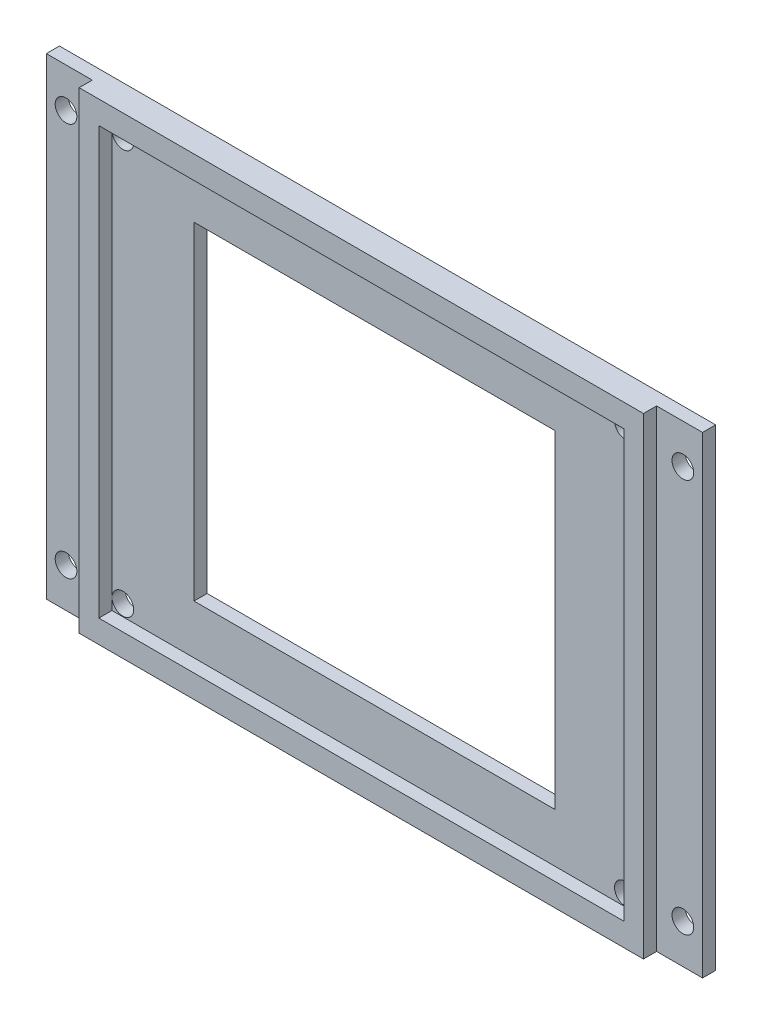
ISO-10303-21;
HEADER;
FILE_DESCRIPTION(('STEP AP214'),'2;1');
FILE_NAME('part.step','',(''),(''),'','','');
FILE_SCHEMA(('AUTOMOTIVE_DESIGN { 1 0 10303 214 1 1 1 1 }'));
ENDSEC;
DATA;
#1=APPLICATION_CONTEXT('core data for automotive mechanical design processes');
#2=APPLICATION_PROTOCOL_DEFINITION('international standard','automotive_design',2000,#1);
#3=PRODUCT_CONTEXT('',#1,'mechanical');
#4=PRODUCT('Part','Part','',(#3));
#5=PRODUCT_RELATED_PRODUCT_CATEGORY('part','',(#4));
#6=PRODUCT_DEFINITION_FORMATION('','',#4);
#7=PRODUCT_DEFINITION_CONTEXT('part definition',#1,'design');
#8=PRODUCT_DEFINITION('design','',#6,#7);
#9=PRODUCT_DEFINITION_SHAPE('','',#8);
#10=(LENGTH_UNIT() NAMED_UNIT(*) SI_UNIT(.MILLI.,.METRE.));
#11=(NAMED_UNIT(*) PLANE_ANGLE_UNIT() SI_UNIT($,.RADIAN.));
#12=(NAMED_UNIT(*) SI_UNIT($,.STERADIAN.) SOLID_ANGLE_UNIT());
#13=UNCERTAINTY_MEASURE_WITH_UNIT(LENGTH_MEASURE(1.E-05),#10,'distance_accuracy_value','');
#14=(GEOMETRIC_REPRESENTATION_CONTEXT(3) GLOBAL_UNCERTAINTY_ASSIGNED_CONTEXT((#13)) GLOBAL_UNIT_ASSIGNED_CONTEXT((#10,
#11,#12)) REPRESENTATION_CONTEXT('',''));
#15=CARTESIAN_POINT('',(0.,0.,0.));
#16=DIRECTION('',(0.,0.,1.));
#17=DIRECTION('',(1.,0.,0.));
#18=AXIS2_PLACEMENT_3D('',#15,#16,#17);
#19=CARTESIAN_POINT('',(-50.,36.,4.));
#20=DIRECTION('',(1.,0.,0.));
#21=DIRECTION('',(0.,1.,0.));
#22=AXIS2_PLACEMENT_3D('',#19,#20,#21);
#23=PLANE('',#22);
#24=DIRECTION('',(0.,-1.,0.));
#25=VECTOR('',#24,1.);
#26=CARTESIAN_POINT('',(-50.,36.,2.));
#27=LINE('',#26,#25);
#28=CARTESIAN_POINT('',(-50.,36.,2.));
#29=VERTEX_POINT('',#28);
#30=CARTESIAN_POINT('',(-50.,-36.,2.));
#31=VERTEX_POINT('',#30);
#32=EDGE_CURVE('E203',#29,#31,#27,.T.);
#33=ORIENTED_EDGE('',*,*,#32,.F.);
#34=DIRECTION('',(0.,0.,-1.));
#35=VECTOR('',#34,1.);
#36=CARTESIAN_POINT('',(-50.,36.,4.));
#37=LINE('',#36,#35);
#38=CARTESIAN_POINT('',(-50.,36.,0.));
#39=VERTEX_POINT('',#38);
#40=EDGE_CURVE('E49',#29,#39,#37,.T.);
#41=ORIENTED_EDGE('',*,*,#40,.T.);
#42=DIRECTION('',(0.,-1.,0.));
#43=VECTOR('',#42,1.);
#44=CARTESIAN_POINT('',(-50.,36.,0.));
#45=LINE('',#44,#43);
#46=CARTESIAN_POINT('',(-50.,-36.,0.));
#47=VERTEX_POINT('',#46);
#48=EDGE_CURVE('E369',#39,#47,#45,.T.);
#49=ORIENTED_EDGE('',*,*,#48,.T.);
#50=DIRECTION('',(0.,0.,-1.));
#51=VECTOR('',#50,1.);
#52=CARTESIAN_POINT('',(-50.,-36.,4.));
#53=LINE('',#52,#51);
#54=EDGE_CURVE('E378',#31,#47,#53,.T.);
#55=ORIENTED_EDGE('',*,*,#54,.F.);
#56=EDGE_LOOP('',(#33,#41,#49,#55));
#57=FACE_BOUND('',#56,.T.);
#58=ADVANCED_FACE('F39',(#57),#23,.F.);
#59=CARTESIAN_POINT('',(-47.,30.,0.));
#60=DIRECTION('',(0.,0.,1.));
#61=DIRECTION('',(1.,0.,0.));
#62=AXIS2_PLACEMENT_3D('',#59,#60,#61);
#63=CYLINDRICAL_SURFACE('',#62,1.65);
#64=CARTESIAN_POINT('',(-47.,30.,0.));
#65=DIRECTION('',(0.,0.,1.));
#66=DIRECTION('',(1.,0.,0.));
#67=AXIS2_PLACEMENT_3D('',#64,#65,#66);
#68=CIRCLE('',#67,1.65);
#69=CARTESIAN_POINT('',(-45.35,30.,0.));
#70=VERTEX_POINT('',#69);
#71=EDGE_CURVE('E264',#70,#70,#68,.T.);
#72=ORIENTED_EDGE('',*,*,#71,.F.);
#73=EDGE_LOOP('',(#72));
#74=FACE_BOUND('',#73,.T.);
#75=CARTESIAN_POINT('',(-47.,30.,2.));
#76=DIRECTION('',(0.,0.,1.));
#77=DIRECTION('',(1.,0.,0.));
#78=AXIS2_PLACEMENT_3D('',#75,#76,#77);
#79=CIRCLE('',#78,1.65);
#80=CARTESIAN_POINT('',(-45.35,30.,2.));
#81=VERTEX_POINT('',#80);
#82=EDGE_CURVE('E251',#81,#81,#79,.F.);
#83=ORIENTED_EDGE('',*,*,#82,.F.);
#84=EDGE_LOOP('',(#83));
#85=FACE_BOUND('',#84,.T.);
#86=ADVANCED_FACE('F391',(#74,#85),#63,.F.);
#87=CARTESIAN_POINT('',(-47.,-30.,0.));
#88=DIRECTION('',(0.,0.,1.));
#89=DIRECTION('',(1.,0.,0.));
#90=AXIS2_PLACEMENT_3D('',#87,#88,#89);
#91=CYLINDRICAL_SURFACE('',#90,1.65);
#92=CARTESIAN_POINT('',(-47.,-30.,0.));
#93=DIRECTION('',(0.,0.,1.));
#94=DIRECTION('',(1.,0.,0.));
#95=AXIS2_PLACEMENT_3D('',#92,#93,#94);
#96=CIRCLE('',#95,1.65);
#97=CARTESIAN_POINT('',(-45.35,-30.,0.));
#98=VERTEX_POINT('',#97);
#99=EDGE_CURVE('E259',#98,#98,#96,.T.);
#100=ORIENTED_EDGE('',*,*,#99,.F.);
#101=EDGE_LOOP('',(#100));
#102=FACE_BOUND('',#101,.T.);
#103=CARTESIAN_POINT('',(-47.,-30.,2.));
#104=DIRECTION('',(0.,0.,1.));
#105=DIRECTION('',(1.,0.,0.));
#106=AXIS2_PLACEMENT_3D('',#103,#104,#105);
#107=CIRCLE('',#106,1.65);
#108=CARTESIAN_POINT('',(-45.35,-30.,2.));
#109=VERTEX_POINT('',#108);
#110=EDGE_CURVE('E226',#109,#109,#107,.F.);
#111=ORIENTED_EDGE('',*,*,#110,.F.);
#112=EDGE_LOOP('',(#111));
#113=FACE_BOUND('',#112,.T.);
#114=ADVANCED_FACE('F389',(#102,#113),#91,.F.);
#115=CARTESIAN_POINT('',(50.,36.,4.));
#116=DIRECTION('',(-1.,0.,0.));
#117=DIRECTION('',(0.,-1.,0.));
#118=AXIS2_PLACEMENT_3D('',#115,#116,#117);
#119=PLANE('',#118);
#120=DIRECTION('',(0.,0.,-1.));
#121=VECTOR('',#120,1.);
#122=CARTESIAN_POINT('',(50.,36.,4.));
#123=LINE('',#122,#121);
#124=CARTESIAN_POINT('',(50.,36.,2.));
#125=VERTEX_POINT('',#124);
#126=CARTESIAN_POINT('',(50.,36.,0.));
#127=VERTEX_POINT('',#126);
#128=EDGE_CURVE('E11',#125,#127,#123,.T.);
#129=ORIENTED_EDGE('',*,*,#128,.F.);
#130=DIRECTION('',(0.,1.,0.));
#131=VECTOR('',#130,1.);
#132=CARTESIAN_POINT('',(50.,36.,2.));
#133=LINE('',#132,#131);
#134=CARTESIAN_POINT('',(50.,-36.,2.));
#135=VERTEX_POINT('',#134);
#136=EDGE_CURVE('E229',#135,#125,#133,.T.);
#137=ORIENTED_EDGE('',*,*,#136,.F.);
#138=DIRECTION('',(0.,0.,-1.));
#139=VECTOR('',#138,1.);
#140=CARTESIAN_POINT('',(50.,-36.,4.));
#141=LINE('',#140,#139);
#142=CARTESIAN_POINT('',(50.,-36.,0.));
#143=VERTEX_POINT('',#142);
#144=EDGE_CURVE('E361',#135,#143,#141,.T.);
#145=ORIENTED_EDGE('',*,*,#144,.T.);
#146=DIRECTION('',(0.,1.,0.));
#147=VECTOR('',#146,1.);
#148=CARTESIAN_POINT('',(50.,36.,0.));
#149=LINE('',#148,#147);
#150=EDGE_CURVE('E342',#143,#127,#149,.T.);
#151=ORIENTED_EDGE('',*,*,#150,.T.);
#152=EDGE_LOOP('',(#129,#137,#145,#151));
#153=FACE_BOUND('',#152,.T.);
#154=ADVANCED_FACE('F41',(#153),#119,.F.);
#155=CARTESIAN_POINT('',(-50.,36.,4.));
#156=DIRECTION('',(0.,-1.,0.));
#157=DIRECTION('',(0.,0.,-1.));
#158=AXIS2_PLACEMENT_3D('',#155,#156,#157);
#159=PLANE('',#158);
#160=DIRECTION('',(-1.,0.,0.));
#161=VECTOR('',#160,1.);
#162=CARTESIAN_POINT('',(-50.,36.,2.));
#163=LINE('',#162,#161);
#164=CARTESIAN_POINT('',(-43.,36.,2.));
#165=VERTEX_POINT('',#164);
#166=EDGE_CURVE('E215',#165,#29,#163,.T.);
#167=ORIENTED_EDGE('',*,*,#166,.F.);
#168=DIRECTION('',(0.,0.,1.));
#169=VECTOR('',#168,1.);
#170=CARTESIAN_POINT('',(-43.,36.,2.));
#171=LINE('',#170,#169);
#172=CARTESIAN_POINT('',(-43.,36.,4.));
#173=VERTEX_POINT('',#172);
#174=EDGE_CURVE('E222',#165,#173,#171,.T.);
#175=ORIENTED_EDGE('',*,*,#174,.T.);
#176=DIRECTION('',(-1.,0.,0.));
#177=VECTOR('',#176,1.);
#178=CARTESIAN_POINT('',(-50.,36.,4.));
#179=LINE('',#178,#177);
#180=CARTESIAN_POINT('',(43.,36.,4.));
#181=VERTEX_POINT('',#180);
#182=EDGE_CURVE('E352',#181,#173,#179,.T.);
#183=ORIENTED_EDGE('',*,*,#182,.F.);
#184=DIRECTION('',(0.,0.,1.));
#185=VECTOR('',#184,1.);
#186=CARTESIAN_POINT('',(43.,36.,2.));
#187=LINE('',#186,#185);
#188=CARTESIAN_POINT('',(43.,36.,2.));
#189=VERTEX_POINT('',#188);
#190=EDGE_CURVE('E243',#189,#181,#187,.T.);
#191=ORIENTED_EDGE('',*,*,#190,.F.);
#192=DIRECTION('',(-1.,0.,0.));
#193=VECTOR('',#192,1.);
#194=CARTESIAN_POINT('',(50.,36.,2.));
#195=LINE('',#194,#193);
#196=EDGE_CURVE('E232',#125,#189,#195,.T.);
#197=ORIENTED_EDGE('',*,*,#196,.F.);
#198=ORIENTED_EDGE('',*,*,#128,.T.);
#199=DIRECTION('',(-1.,0.,0.));
#200=VECTOR('',#199,1.);
#201=CARTESIAN_POINT('',(-50.,36.,0.));
#202=LINE('',#201,#200);
#203=EDGE_CURVE('E365',#127,#39,#202,.T.);
#204=ORIENTED_EDGE('',*,*,#203,.T.);
#205=ORIENTED_EDGE('',*,*,#40,.F.);
#206=EDGE_LOOP('',(#167,#175,#183,#191,#197,#198,#204,#205));
#207=FACE_BOUND('',#206,.T.);
#208=ADVANCED_FACE('F398',(#207),#159,.F.);
#209=CARTESIAN_POINT('',(-50.,-36.,4.));
#210=DIRECTION('',(0.,1.,0.));
#211=DIRECTION('',(0.,0.,1.));
#212=AXIS2_PLACEMENT_3D('',#209,#210,#211);
#213=PLANE('',#212);
#214=DIRECTION('',(1.,0.,0.));
#215=VECTOR('',#214,1.);
#216=CARTESIAN_POINT('',(-50.,-36.,4.));
#217=LINE('',#216,#215);
#218=CARTESIAN_POINT('',(-43.,-36.,4.));
#219=VERTEX_POINT('',#218);
#220=CARTESIAN_POINT('',(43.,-36.,4.));
#221=VERTEX_POINT('',#220);
#222=EDGE_CURVE('E356',#219,#221,#217,.T.);
#223=ORIENTED_EDGE('',*,*,#222,.F.);
#224=DIRECTION('',(0.,0.,1.));
#225=VECTOR('',#224,1.);
#226=CARTESIAN_POINT('',(-43.,-36.,2.));
#227=LINE('',#226,#225);
#228=CARTESIAN_POINT('',(-43.,-36.,2.));
#229=VERTEX_POINT('',#228);
#230=EDGE_CURVE('E218',#229,#219,#227,.T.);
#231=ORIENTED_EDGE('',*,*,#230,.F.);
#232=DIRECTION('',(1.,0.,0.));
#233=VECTOR('',#232,1.);
#234=CARTESIAN_POINT('',(-50.,-36.,2.));
#235=LINE('',#234,#233);
#236=EDGE_CURVE('E206',#31,#229,#235,.T.);
#237=ORIENTED_EDGE('',*,*,#236,.F.);
#238=ORIENTED_EDGE('',*,*,#54,.T.);
#239=DIRECTION('',(1.,0.,0.));
#240=VECTOR('',#239,1.);
#241=CARTESIAN_POINT('',(-50.,-36.,0.));
#242=LINE('',#241,#240);
#243=EDGE_CURVE('E357',#47,#143,#242,.T.);
#244=ORIENTED_EDGE('',*,*,#243,.T.);
#245=ORIENTED_EDGE('',*,*,#144,.F.);
#246=DIRECTION('',(1.,0.,0.));
#247=VECTOR('',#246,1.);
#248=CARTESIAN_POINT('',(50.,-36.,2.));
#249=LINE('',#248,#247);
#250=CARTESIAN_POINT('',(43.,-36.,2.));
#251=VERTEX_POINT('',#250);
#252=EDGE_CURVE('E240',#251,#135,#249,.T.);
#253=ORIENTED_EDGE('',*,*,#252,.F.);
#254=DIRECTION('',(0.,0.,1.));
#255=VECTOR('',#254,1.);
#256=CARTESIAN_POINT('',(43.,-36.,2.));
#257=LINE('',#256,#255);
#258=EDGE_CURVE('E221',#251,#221,#257,.T.);
#259=ORIENTED_EDGE('',*,*,#258,.T.);
#260=EDGE_LOOP('',(#223,#231,#237,#238,#244,#245,#253,#259));
#261=FACE_BOUND('',#260,.T.);
#262=ADVANCED_FACE('F411',(#261),#213,.F.);
#263=CARTESIAN_POINT('',(0.,0.,4.));
#264=DIRECTION('',(0.,0.,1.));
#265=DIRECTION('',(1.,0.,0.));
#266=AXIS2_PLACEMENT_3D('',#263,#264,#265);
#267=PLANE('',#266);
#268=DIRECTION('',(0.,1.,0.));
#269=VECTOR('',#268,1.);
#270=CARTESIAN_POINT('',(-43.,36.,4.));
#271=LINE('',#270,#269);
#272=EDGE_CURVE('E207',#219,#173,#271,.T.);
#273=ORIENTED_EDGE('',*,*,#272,.F.);
#274=ORIENTED_EDGE('',*,*,#222,.T.);
#275=DIRECTION('',(0.,-1.,0.));
#276=VECTOR('',#275,1.);
#277=CARTESIAN_POINT('',(43.,36.,4.));
#278=LINE('',#277,#276);
#279=EDGE_CURVE('E197',#181,#221,#278,.T.);
#280=ORIENTED_EDGE('',*,*,#279,.F.);
#281=ORIENTED_EDGE('',*,*,#182,.T.);
#282=EDGE_LOOP('',(#273,#274,#280,#281));
#283=FACE_BOUND('',#282,.T.);
#284=DIRECTION('',(0.,1.,0.));
#285=VECTOR('',#284,1.);
#286=CARTESIAN_POINT('',(40.,32.5,4.));
#287=LINE('',#286,#285);
#288=CARTESIAN_POINT('',(40.,-32.5,4.));
#289=VERTEX_POINT('',#288);
#290=CARTESIAN_POINT('',(40.,32.5,4.));
#291=VERTEX_POINT('',#290);
#292=EDGE_CURVE('E304',#289,#291,#287,.T.);
#293=ORIENTED_EDGE('',*,*,#292,.F.);
#294=DIRECTION('',(1.,0.,0.));
#295=VECTOR('',#294,1.);
#296=CARTESIAN_POINT('',(-40.,-32.5,4.));
#297=LINE('',#296,#295);
#298=CARTESIAN_POINT('',(-40.,-32.5,4.));
#299=VERTEX_POINT('',#298);
#300=EDGE_CURVE('E313',#299,#289,#297,.T.);
#301=ORIENTED_EDGE('',*,*,#300,.F.);
#302=DIRECTION('',(0.,-1.,0.));
#303=VECTOR('',#302,1.);
#304=CARTESIAN_POINT('',(-40.,32.5,4.));
#305=LINE('',#304,#303);
#306=CARTESIAN_POINT('',(-40.,32.5,4.));
#307=VERTEX_POINT('',#306);
#308=EDGE_CURVE('E332',#307,#299,#305,.T.);
#309=ORIENTED_EDGE('',*,*,#308,.F.);
#310=DIRECTION('',(-1.,0.,0.));
#311=VECTOR('',#310,1.);
#312=CARTESIAN_POINT('',(-40.,32.5,4.));
#313=LINE('',#312,#311);
#314=EDGE_CURVE('E328',#291,#307,#313,.T.);
#315=ORIENTED_EDGE('',*,*,#314,.F.);
#316=EDGE_LOOP('',(#293,#301,#309,#315));
#317=FACE_BOUND('',#316,.T.);
#318=ADVANCED_FACE('F418',(#283,#317),#267,.T.);
#319=CARTESIAN_POINT('',(0.,0.,0.));
#320=DIRECTION('',(0.,0.,1.));
#321=DIRECTION('',(1.,0.,0.));
#322=AXIS2_PLACEMENT_3D('',#319,#320,#321);
#323=PLANE('',#322);
#324=DIRECTION('',(1.,0.,0.));
#325=VECTOR('',#324,1.);
#326=CARTESIAN_POINT('',(-27.5,-25.,0.));
#327=LINE('',#326,#325);
#328=CARTESIAN_POINT('',(-27.5,-25.,0.));
#329=VERTEX_POINT('',#328);
#330=CARTESIAN_POINT('',(27.5,-25.,0.));
#331=VERTEX_POINT('',#330);
#332=EDGE_CURVE('E163',#329,#331,#327,.T.);
#333=ORIENTED_EDGE('',*,*,#332,.T.);
#334=DIRECTION('',(0.,1.,0.));
#335=VECTOR('',#334,1.);
#336=CARTESIAN_POINT('',(27.5,25.,0.));
#337=LINE('',#336,#335);
#338=CARTESIAN_POINT('',(27.5,25.,0.));
#339=VERTEX_POINT('',#338);
#340=EDGE_CURVE('E156',#331,#339,#337,.T.);
#341=ORIENTED_EDGE('',*,*,#340,.T.);
#342=DIRECTION('',(-1.,0.,0.));
#343=VECTOR('',#342,1.);
#344=CARTESIAN_POINT('',(-27.5,25.,0.));
#345=LINE('',#344,#343);
#346=CARTESIAN_POINT('',(-27.5,25.,0.));
#347=VERTEX_POINT('',#346);
#348=EDGE_CURVE('E166',#339,#347,#345,.T.);
#349=ORIENTED_EDGE('',*,*,#348,.T.);
#350=DIRECTION('',(0.,-1.,0.));
#351=VECTOR('',#350,1.);
#352=CARTESIAN_POINT('',(-27.5,25.,0.));
#353=LINE('',#352,#351);
#354=EDGE_CURVE('E57',#347,#329,#353,.T.);
#355=ORIENTED_EDGE('',*,*,#354,.T.);
#356=EDGE_LOOP('',(#333,#341,#349,#355));
#357=FACE_BOUND('',#356,.T.);
#358=ORIENTED_EDGE('',*,*,#99,.T.);
#359=EDGE_LOOP('',(#358));
#360=FACE_BOUND('',#359,.T.);
#361=CARTESIAN_POINT('',(47.,-30.,0.));
#362=DIRECTION('',(0.,0.,1.));
#363=DIRECTION('',(1.,0.,0.));
#364=AXIS2_PLACEMENT_3D('',#361,#362,#363);
#365=CIRCLE('',#364,1.65);
#366=CARTESIAN_POINT('',(48.65,-30.,0.));
#367=VERTEX_POINT('',#366);
#368=EDGE_CURVE('E265',#367,#367,#365,.T.);
#369=ORIENTED_EDGE('',*,*,#368,.T.);
#370=EDGE_LOOP('',(#369));
#371=FACE_BOUND('',#370,.T.);
#372=CARTESIAN_POINT('',(47.,30.,0.));
#373=DIRECTION('',(0.,0.,1.));
#374=DIRECTION('',(1.,0.,0.));
#375=AXIS2_PLACEMENT_3D('',#372,#373,#374);
#376=CIRCLE('',#375,1.65);
#377=CARTESIAN_POINT('',(48.65,30.,0.));
#378=VERTEX_POINT('',#377);
#379=EDGE_CURVE('E260',#378,#378,#376,.T.);
#380=ORIENTED_EDGE('',*,*,#379,.T.);
#381=EDGE_LOOP('',(#380));
#382=FACE_BOUND('',#381,.T.);
#383=ORIENTED_EDGE('',*,*,#71,.T.);
#384=EDGE_LOOP('',(#383));
#385=FACE_BOUND('',#384,.T.);
#386=CARTESIAN_POINT('',(-38.3403916412942,-30.7585866803809,0.));
#387=DIRECTION('',(0.,0.,1.));
#388=DIRECTION('',(1.,0.,0.));
#389=AXIS2_PLACEMENT_3D('',#386,#387,#388);
#390=CIRCLE('',#389,1.65);
#391=CARTESIAN_POINT('',(-36.6903916412942,-30.7585866803809,0.));
#392=VERTEX_POINT('',#391);
#393=EDGE_CURVE('E293',#392,#392,#390,.T.);
#394=ORIENTED_EDGE('',*,*,#393,.T.);
#395=EDGE_LOOP('',(#394));
#396=FACE_BOUND('',#395,.T.);
#397=CARTESIAN_POINT('',(38.2406083587058,-30.7585866803809,0.));
#398=DIRECTION('',(0.,0.,1.));
#399=DIRECTION('',(1.,0.,0.));
#400=AXIS2_PLACEMENT_3D('',#397,#398,#399);
#401=CIRCLE('',#400,1.65);
#402=CARTESIAN_POINT('',(39.8906083587058,-30.7585866803809,0.));
#403=VERTEX_POINT('',#402);
#404=EDGE_CURVE('E285',#403,#403,#401,.T.);
#405=ORIENTED_EDGE('',*,*,#404,.T.);
#406=EDGE_LOOP('',(#405));
#407=FACE_BOUND('',#406,.T.);
#408=CARTESIAN_POINT('',(38.2406083587058,30.8364133196191,0.));
#409=DIRECTION('',(0.,0.,1.));
#410=DIRECTION('',(1.,0.,0.));
#411=AXIS2_PLACEMENT_3D('',#408,#409,#410);
#412=CIRCLE('',#411,1.65);
#413=CARTESIAN_POINT('',(39.8906083587058,30.8364133196191,0.));
#414=VERTEX_POINT('',#413);
#415=EDGE_CURVE('E276',#414,#414,#412,.T.);
#416=ORIENTED_EDGE('',*,*,#415,.T.);
#417=EDGE_LOOP('',(#416));
#418=FACE_BOUND('',#417,.T.);
#419=CARTESIAN_POINT('',(-38.3403916412942,30.8364133196191,0.));
#420=DIRECTION('',(0.,0.,1.));
#421=DIRECTION('',(1.,0.,0.));
#422=AXIS2_PLACEMENT_3D('',#419,#420,#421);
#423=CIRCLE('',#422,1.65);
#424=CARTESIAN_POINT('',(-36.6903916412942,30.8364133196191,0.));
#425=VERTEX_POINT('',#424);
#426=EDGE_CURVE('E300',#425,#425,#423,.T.);
#427=ORIENTED_EDGE('',*,*,#426,.T.);
#428=EDGE_LOOP('',(#427));
#429=FACE_BOUND('',#428,.T.);
#430=ORIENTED_EDGE('',*,*,#150,.F.);
#431=ORIENTED_EDGE('',*,*,#243,.F.);
#432=ORIENTED_EDGE('',*,*,#48,.F.);
#433=ORIENTED_EDGE('',*,*,#203,.F.);
#434=EDGE_LOOP('',(#430,#431,#432,#433));
#435=FACE_BOUND('',#434,.T.);
#436=ADVANCED_FACE('F171',(#357,#360,#371,#382,#385,#396,#407,#418,#429,#435),#323,.F.);
#437=CARTESIAN_POINT('',(40.,32.5,2.));
#438=DIRECTION('',(1.,0.,0.));
#439=DIRECTION('',(0.,0.,-1.));
#440=AXIS2_PLACEMENT_3D('',#437,#438,#439);
#441=PLANE('',#440);
#442=ORIENTED_EDGE('',*,*,#292,.T.);
#443=DIRECTION('',(0.,0.,1.));
#444=VECTOR('',#443,1.);
#445=CARTESIAN_POINT('',(40.,32.5,2.));
#446=LINE('',#445,#444);
#447=CARTESIAN_POINT('',(40.,32.5,2.));
#448=VERTEX_POINT('',#447);
#449=EDGE_CURVE('E325',#448,#291,#446,.T.);
#450=ORIENTED_EDGE('',*,*,#449,.F.);
#451=DIRECTION('',(0.,1.,0.));
#452=VECTOR('',#451,1.);
#453=CARTESIAN_POINT('',(40.,32.5,2.));
#454=LINE('',#453,#452);
#455=CARTESIAN_POINT('',(40.,-32.5,2.));
#456=VERTEX_POINT('',#455);
#457=EDGE_CURVE('E308',#456,#448,#454,.T.);
#458=ORIENTED_EDGE('',*,*,#457,.F.);
#459=DIRECTION('',(0.,0.,1.));
#460=VECTOR('',#459,1.);
#461=CARTESIAN_POINT('',(40.,-32.5,2.));
#462=LINE('',#461,#460);
#463=EDGE_CURVE('E339',#456,#289,#462,.T.);
#464=ORIENTED_EDGE('',*,*,#463,.T.);
#465=EDGE_LOOP('',(#442,#450,#458,#464));
#466=FACE_BOUND('',#465,.T.);
#467=ADVANCED_FACE('F451',(#466),#441,.F.);
#468=CARTESIAN_POINT('',(-40.,-32.5,2.));
#469=DIRECTION('',(0.,-1.,0.));
#470=DIRECTION('',(0.,0.,-1.));
#471=AXIS2_PLACEMENT_3D('',#468,#469,#470);
#472=PLANE('',#471);
#473=ORIENTED_EDGE('',*,*,#300,.T.);
#474=ORIENTED_EDGE('',*,*,#463,.F.);
#475=DIRECTION('',(1.,0.,0.));
#476=VECTOR('',#475,1.);
#477=CARTESIAN_POINT('',(-40.,-32.5,2.));
#478=LINE('',#477,#476);
#479=CARTESIAN_POINT('',(-40.,-32.5,2.));
#480=VERTEX_POINT('',#479);
#481=EDGE_CURVE('E321',#480,#456,#478,.T.);
#482=ORIENTED_EDGE('',*,*,#481,.F.);
#483=DIRECTION('',(0.,0.,1.));
#484=VECTOR('',#483,1.);
#485=CARTESIAN_POINT('',(-40.,-32.5,2.));
#486=LINE('',#485,#484);
#487=EDGE_CURVE('E343',#480,#299,#486,.T.);
#488=ORIENTED_EDGE('',*,*,#487,.T.);
#489=EDGE_LOOP('',(#473,#474,#482,#488));
#490=FACE_BOUND('',#489,.T.);
#491=ADVANCED_FACE('F456',(#490),#472,.F.);
#492=CARTESIAN_POINT('',(-40.,32.5,2.));
#493=DIRECTION('',(-1.,0.,0.));
#494=DIRECTION('',(0.,-1.,0.));
#495=AXIS2_PLACEMENT_3D('',#492,#493,#494);
#496=PLANE('',#495);
#497=ORIENTED_EDGE('',*,*,#308,.T.);
#498=ORIENTED_EDGE('',*,*,#487,.F.);
#499=DIRECTION('',(0.,-1.,0.));
#500=VECTOR('',#499,1.);
#501=CARTESIAN_POINT('',(-40.,32.5,2.));
#502=LINE('',#501,#500);
#503=CARTESIAN_POINT('',(-40.,32.5,2.));
#504=VERTEX_POINT('',#503);
#505=EDGE_CURVE('E317',#504,#480,#502,.T.);
#506=ORIENTED_EDGE('',*,*,#505,.F.);
#507=DIRECTION('',(0.,0.,1.));
#508=VECTOR('',#507,1.);
#509=CARTESIAN_POINT('',(-40.,32.5,2.));
#510=LINE('',#509,#508);
#511=EDGE_CURVE('E346',#504,#307,#510,.T.);
#512=ORIENTED_EDGE('',*,*,#511,.T.);
#513=EDGE_LOOP('',(#497,#498,#506,#512));
#514=FACE_BOUND('',#513,.T.);
#515=ADVANCED_FACE('F465',(#514),#496,.F.);
#516=CARTESIAN_POINT('',(-40.,32.5,2.));
#517=DIRECTION('',(0.,1.,0.));
#518=DIRECTION('',(0.,0.,1.));
#519=AXIS2_PLACEMENT_3D('',#516,#517,#518);
#520=PLANE('',#519);
#521=ORIENTED_EDGE('',*,*,#314,.T.);
#522=ORIENTED_EDGE('',*,*,#511,.F.);
#523=DIRECTION('',(-1.,0.,0.));
#524=VECTOR('',#523,1.);
#525=CARTESIAN_POINT('',(-40.,32.5,2.));
#526=LINE('',#525,#524);
#527=EDGE_CURVE('E312',#448,#504,#526,.T.);
#528=ORIENTED_EDGE('',*,*,#527,.F.);
#529=ORIENTED_EDGE('',*,*,#449,.T.);
#530=EDGE_LOOP('',(#521,#522,#528,#529));
#531=FACE_BOUND('',#530,.T.);
#532=ADVANCED_FACE('F461',(#531),#520,.F.);
#533=CARTESIAN_POINT('',(0.,0.,2.));
#534=DIRECTION('',(0.,0.,1.));
#535=DIRECTION('',(1.,0.,0.));
#536=AXIS2_PLACEMENT_3D('',#533,#534,#535);
#537=PLANE('',#536);
#538=DIRECTION('',(0.,1.,0.));
#539=VECTOR('',#538,1.);
#540=CARTESIAN_POINT('',(27.5,25.,2.));
#541=LINE('',#540,#539);
#542=CARTESIAN_POINT('',(27.5,-25.,2.));
#543=VERTEX_POINT('',#542);
#544=CARTESIAN_POINT('',(27.5,25.,2.));
#545=VERTEX_POINT('',#544);
#546=EDGE_CURVE('E65',#543,#545,#541,.T.);
#547=ORIENTED_EDGE('',*,*,#546,.F.);
#548=DIRECTION('',(1.,0.,0.));
#549=VECTOR('',#548,1.);
#550=CARTESIAN_POINT('',(-27.5,-25.,2.));
#551=LINE('',#550,#549);
#552=CARTESIAN_POINT('',(-27.5,-25.,2.));
#553=VERTEX_POINT('',#552);
#554=EDGE_CURVE('E175',#553,#543,#551,.T.);
#555=ORIENTED_EDGE('',*,*,#554,.F.);
#556=DIRECTION('',(0.,-1.,0.));
#557=VECTOR('',#556,1.);
#558=CARTESIAN_POINT('',(-27.5,25.,2.));
#559=LINE('',#558,#557);
#560=CARTESIAN_POINT('',(-27.5,25.,2.));
#561=VERTEX_POINT('',#560);
#562=EDGE_CURVE('E179',#561,#553,#559,.T.);
#563=ORIENTED_EDGE('',*,*,#562,.F.);
#564=DIRECTION('',(-1.,0.,0.));
#565=VECTOR('',#564,1.);
#566=CARTESIAN_POINT('',(-27.5,25.,2.));
#567=LINE('',#566,#565);
#568=EDGE_CURVE('E188',#545,#561,#567,.T.);
#569=ORIENTED_EDGE('',*,*,#568,.F.);
#570=EDGE_LOOP('',(#547,#555,#563,#569));
#571=FACE_BOUND('',#570,.T.);
#572=CARTESIAN_POINT('',(-38.3403916412942,-30.7585866803809,2.));
#573=DIRECTION('',(0.,0.,1.));
#574=DIRECTION('',(1.,0.,0.));
#575=AXIS2_PLACEMENT_3D('',#572,#573,#574);
#576=CIRCLE('',#575,1.65);
#577=CARTESIAN_POINT('',(-36.6903916412942,-30.7585866803809,2.));
#578=VERTEX_POINT('',#577);
#579=EDGE_CURVE('E275',#578,#578,#576,.T.);
#580=ORIENTED_EDGE('',*,*,#579,.F.);
#581=EDGE_LOOP('',(#580));
#582=FACE_BOUND('',#581,.T.);
#583=CARTESIAN_POINT('',(38.2406083587058,-30.7585866803809,2.));
#584=DIRECTION('',(0.,0.,1.));
#585=DIRECTION('',(1.,0.,0.));
#586=AXIS2_PLACEMENT_3D('',#583,#584,#585);
#587=CIRCLE('',#586,1.65);
#588=CARTESIAN_POINT('',(39.8906083587058,-30.7585866803809,2.));
#589=VERTEX_POINT('',#588);
#590=EDGE_CURVE('E289',#589,#589,#587,.T.);
#591=ORIENTED_EDGE('',*,*,#590,.F.);
#592=EDGE_LOOP('',(#591));
#593=FACE_BOUND('',#592,.T.);
#594=CARTESIAN_POINT('',(38.2406083587058,30.8364133196191,2.));
#595=DIRECTION('',(0.,0.,1.));
#596=DIRECTION('',(1.,0.,0.));
#597=AXIS2_PLACEMENT_3D('',#594,#595,#596);
#598=CIRCLE('',#597,1.65);
#599=CARTESIAN_POINT('',(39.8906083587058,30.8364133196191,2.));
#600=VERTEX_POINT('',#599);
#601=EDGE_CURVE('E281',#600,#600,#598,.T.);
#602=ORIENTED_EDGE('',*,*,#601,.F.);
#603=EDGE_LOOP('',(#602));
#604=FACE_BOUND('',#603,.T.);
#605=CARTESIAN_POINT('',(-38.3403916412942,30.8364133196191,2.));
#606=DIRECTION('',(0.,0.,1.));
#607=DIRECTION('',(1.,0.,0.));
#608=AXIS2_PLACEMENT_3D('',#605,#606,#607);
#609=CIRCLE('',#608,1.65);
#610=CARTESIAN_POINT('',(-36.6903916412942,30.8364133196191,2.));
#611=VERTEX_POINT('',#610);
#612=EDGE_CURVE('E280',#611,#611,#609,.T.);
#613=ORIENTED_EDGE('',*,*,#612,.F.);
#614=EDGE_LOOP('',(#613));
#615=FACE_BOUND('',#614,.T.);
#616=ORIENTED_EDGE('',*,*,#457,.T.);
#617=ORIENTED_EDGE('',*,*,#527,.T.);
#618=ORIENTED_EDGE('',*,*,#505,.T.);
#619=ORIENTED_EDGE('',*,*,#481,.T.);
#620=EDGE_LOOP('',(#616,#617,#618,#619));
#621=FACE_BOUND('',#620,.T.);
#622=ADVANCED_FACE('F464',(#571,#582,#593,#604,#615,#621),#537,.T.);
#623=CARTESIAN_POINT('',(-38.3403916412942,30.8364133196191,0.));
#624=DIRECTION('',(0.,0.,1.));
#625=DIRECTION('',(1.,0.,0.));
#626=AXIS2_PLACEMENT_3D('',#623,#624,#625);
#627=CYLINDRICAL_SURFACE('',#626,1.65);
#628=ORIENTED_EDGE('',*,*,#426,.F.);
#629=EDGE_LOOP('',(#628));
#630=FACE_BOUND('',#629,.T.);
#631=ORIENTED_EDGE('',*,*,#612,.T.);
#632=EDGE_LOOP('',(#631));
#633=FACE_BOUND('',#632,.T.);
#634=ADVANCED_FACE('F475',(#630,#633),#627,.F.);
#635=CARTESIAN_POINT('',(38.2406083587058,30.8364133196191,0.));
#636=DIRECTION('',(0.,0.,1.));
#637=DIRECTION('',(1.,0.,0.));
#638=AXIS2_PLACEMENT_3D('',#635,#636,#637);
#639=CYLINDRICAL_SURFACE('',#638,1.65);
#640=ORIENTED_EDGE('',*,*,#415,.F.);
#641=EDGE_LOOP('',(#640));
#642=FACE_BOUND('',#641,.T.);
#643=ORIENTED_EDGE('',*,*,#601,.T.);
#644=EDGE_LOOP('',(#643));
#645=FACE_BOUND('',#644,.T.);
#646=ADVANCED_FACE('F479',(#642,#645),#639,.F.);
#647=CARTESIAN_POINT('',(38.2406083587058,-30.7585866803809,0.));
#648=DIRECTION('',(0.,0.,1.));
#649=DIRECTION('',(1.,0.,0.));
#650=AXIS2_PLACEMENT_3D('',#647,#648,#649);
#651=CYLINDRICAL_SURFACE('',#650,1.65);
#652=ORIENTED_EDGE('',*,*,#404,.F.);
#653=EDGE_LOOP('',(#652));
#654=FACE_BOUND('',#653,.T.);
#655=ORIENTED_EDGE('',*,*,#590,.T.);
#656=EDGE_LOOP('',(#655));
#657=FACE_BOUND('',#656,.T.);
#658=ADVANCED_FACE('F485',(#654,#657),#651,.F.);
#659=CARTESIAN_POINT('',(-38.3403916412942,-30.7585866803809,0.));
#660=DIRECTION('',(0.,0.,1.));
#661=DIRECTION('',(1.,0.,0.));
#662=AXIS2_PLACEMENT_3D('',#659,#660,#661);
#663=CYLINDRICAL_SURFACE('',#662,1.65);
#664=ORIENTED_EDGE('',*,*,#393,.F.);
#665=EDGE_LOOP('',(#664));
#666=FACE_BOUND('',#665,.T.);
#667=ORIENTED_EDGE('',*,*,#579,.T.);
#668=EDGE_LOOP('',(#667));
#669=FACE_BOUND('',#668,.T.);
#670=ADVANCED_FACE('F481',(#666,#669),#663,.F.);
#671=CARTESIAN_POINT('',(47.,30.,0.));
#672=DIRECTION('',(0.,0.,1.));
#673=DIRECTION('',(1.,0.,0.));
#674=AXIS2_PLACEMENT_3D('',#671,#672,#673);
#675=CYLINDRICAL_SURFACE('',#674,1.65);
#676=CARTESIAN_POINT('',(47.,30.,2.));
#677=DIRECTION('',(0.,0.,-1.));
#678=DIRECTION('',(-1.,0.,0.));
#679=AXIS2_PLACEMENT_3D('',#676,#677,#678);
#680=CIRCLE('',#679,1.65);
#681=CARTESIAN_POINT('',(45.35,30.,2.));
#682=VERTEX_POINT('',#681);
#683=EDGE_CURVE('E255',#682,#682,#680,.F.);
#684=ORIENTED_EDGE('',*,*,#683,.T.);
#685=EDGE_LOOP('',(#684));
#686=FACE_BOUND('',#685,.T.);
#687=ORIENTED_EDGE('',*,*,#379,.F.);
#688=EDGE_LOOP('',(#687));
#689=FACE_BOUND('',#688,.T.);
#690=ADVANCED_FACE('F484',(#686,#689),#675,.F.);
#691=CARTESIAN_POINT('',(47.,-30.,0.));
#692=DIRECTION('',(0.,0.,1.));
#693=DIRECTION('',(1.,0.,0.));
#694=AXIS2_PLACEMENT_3D('',#691,#692,#693);
#695=CYLINDRICAL_SURFACE('',#694,1.65);
#696=CARTESIAN_POINT('',(47.,-30.,2.));
#697=DIRECTION('',(0.,0.,-1.));
#698=DIRECTION('',(-1.,0.,0.));
#699=AXIS2_PLACEMENT_3D('',#696,#697,#698);
#700=CIRCLE('',#699,1.65);
#701=CARTESIAN_POINT('',(45.35,-30.,2.));
#702=VERTEX_POINT('',#701);
#703=EDGE_CURVE('E43',#702,#702,#700,.F.);
#704=ORIENTED_EDGE('',*,*,#703,.T.);
#705=EDGE_LOOP('',(#704));
#706=FACE_BOUND('',#705,.T.);
#707=ORIENTED_EDGE('',*,*,#368,.F.);
#708=EDGE_LOOP('',(#707));
#709=FACE_BOUND('',#708,.T.);
#710=ADVANCED_FACE('F529',(#706,#709),#695,.F.);
#711=CARTESIAN_POINT('',(0.,0.,2.));
#712=DIRECTION('',(0.,0.,1.));
#713=DIRECTION('',(1.,0.,0.));
#714=AXIS2_PLACEMENT_3D('',#711,#712,#713);
#715=PLANE('',#714);
#716=ORIENTED_EDGE('',*,*,#32,.T.);
#717=ORIENTED_EDGE('',*,*,#236,.T.);
#718=DIRECTION('',(0.,1.,0.));
#719=VECTOR('',#718,1.);
#720=CARTESIAN_POINT('',(-43.,36.,2.));
#721=LINE('',#720,#719);
#722=EDGE_CURVE('E211',#229,#165,#721,.T.);
#723=ORIENTED_EDGE('',*,*,#722,.T.);
#724=ORIENTED_EDGE('',*,*,#166,.T.);
#725=EDGE_LOOP('',(#716,#717,#723,#724));
#726=FACE_BOUND('',#725,.T.);
#727=ORIENTED_EDGE('',*,*,#110,.T.);
#728=EDGE_LOOP('',(#727));
#729=FACE_BOUND('',#728,.T.);
#730=ORIENTED_EDGE('',*,*,#82,.T.);
#731=EDGE_LOOP('',(#730));
#732=FACE_BOUND('',#731,.T.);
#733=ADVANCED_FACE('F386',(#726,#729,#732),#715,.T.);
#734=CARTESIAN_POINT('',(-43.,36.,2.));
#735=DIRECTION('',(1.,0.,0.));
#736=DIRECTION('',(0.,1.,0.));
#737=AXIS2_PLACEMENT_3D('',#734,#735,#736);
#738=PLANE('',#737);
#739=ORIENTED_EDGE('',*,*,#272,.T.);
#740=ORIENTED_EDGE('',*,*,#174,.F.);
#741=ORIENTED_EDGE('',*,*,#722,.F.);
#742=ORIENTED_EDGE('',*,*,#230,.T.);
#743=EDGE_LOOP('',(#739,#740,#741,#742));
#744=FACE_BOUND('',#743,.T.);
#745=ADVANCED_FACE('F434',(#744),#738,.F.);
#746=CARTESIAN_POINT('',(0.,0.,2.));
#747=DIRECTION('',(0.,0.,-1.));
#748=DIRECTION('',(-1.,0.,0.));
#749=AXIS2_PLACEMENT_3D('',#746,#747,#748);
#750=PLANE('',#749);
#751=ORIENTED_EDGE('',*,*,#703,.F.);
#752=EDGE_LOOP('',(#751));
#753=FACE_BOUND('',#752,.T.);
#754=ORIENTED_EDGE('',*,*,#136,.T.);
#755=ORIENTED_EDGE('',*,*,#196,.T.);
#756=DIRECTION('',(0.,-1.,0.));
#757=VECTOR('',#756,1.);
#758=CARTESIAN_POINT('',(43.,36.,2.));
#759=LINE('',#758,#757);
#760=EDGE_CURVE('E236',#189,#251,#759,.T.);
#761=ORIENTED_EDGE('',*,*,#760,.T.);
#762=ORIENTED_EDGE('',*,*,#252,.T.);
#763=EDGE_LOOP('',(#754,#755,#761,#762));
#764=FACE_BOUND('',#763,.T.);
#765=ORIENTED_EDGE('',*,*,#683,.F.);
#766=EDGE_LOOP('',(#765));
#767=FACE_BOUND('',#766,.T.);
#768=ADVANCED_FACE('F445',(#753,#764,#767),#750,.F.);
#769=CARTESIAN_POINT('',(43.,36.,2.));
#770=DIRECTION('',(-1.,0.,0.));
#771=DIRECTION('',(0.,-1.,0.));
#772=AXIS2_PLACEMENT_3D('',#769,#770,#771);
#773=PLANE('',#772);
#774=ORIENTED_EDGE('',*,*,#279,.T.);
#775=ORIENTED_EDGE('',*,*,#258,.F.);
#776=ORIENTED_EDGE('',*,*,#760,.F.);
#777=ORIENTED_EDGE('',*,*,#190,.T.);
#778=EDGE_LOOP('',(#774,#775,#776,#777));
#779=FACE_BOUND('',#778,.T.);
#780=ADVANCED_FACE('F442',(#779),#773,.F.);
#781=CARTESIAN_POINT('',(27.5,25.,0.));
#782=DIRECTION('',(1.,0.,0.));
#783=DIRECTION('',(0.,1.,0.));
#784=AXIS2_PLACEMENT_3D('',#781,#782,#783);
#785=PLANE('',#784);
#786=ORIENTED_EDGE('',*,*,#546,.T.);
#787=DIRECTION('',(0.,0.,1.));
#788=VECTOR('',#787,1.);
#789=CARTESIAN_POINT('',(27.5,25.,0.));
#790=LINE('',#789,#788);
#791=EDGE_CURVE('E152',#339,#545,#790,.T.);
#792=ORIENTED_EDGE('',*,*,#791,.F.);
#793=ORIENTED_EDGE('',*,*,#340,.F.);
#794=DIRECTION('',(0.,0.,1.));
#795=VECTOR('',#794,1.);
#796=CARTESIAN_POINT('',(27.5,-25.,0.));
#797=LINE('',#796,#795);
#798=EDGE_CURVE('E194',#331,#543,#797,.T.);
#799=ORIENTED_EDGE('',*,*,#798,.T.);
#800=EDGE_LOOP('',(#786,#792,#793,#799));
#801=FACE_BOUND('',#800,.T.);
#802=ADVANCED_FACE('F154',(#801),#785,.F.);
#803=CARTESIAN_POINT('',(-27.5,-25.,0.));
#804=DIRECTION('',(0.,-1.,0.));
#805=DIRECTION('',(0.,0.,-1.));
#806=AXIS2_PLACEMENT_3D('',#803,#804,#805);
#807=PLANE('',#806);
#808=ORIENTED_EDGE('',*,*,#554,.T.);
#809=ORIENTED_EDGE('',*,*,#798,.F.);
#810=ORIENTED_EDGE('',*,*,#332,.F.);
#811=DIRECTION('',(0.,0.,1.));
#812=VECTOR('',#811,1.);
#813=CARTESIAN_POINT('',(-27.5,-25.,0.));
#814=LINE('',#813,#812);
#815=EDGE_CURVE('E198',#329,#553,#814,.T.);
#816=ORIENTED_EDGE('',*,*,#815,.T.);
#817=EDGE_LOOP('',(#808,#809,#810,#816));
#818=FACE_BOUND('',#817,.T.);
#819=ADVANCED_FACE('F569',(#818),#807,.F.);
#820=CARTESIAN_POINT('',(-27.5,25.,0.));
#821=DIRECTION('',(-1.,0.,0.));
#822=DIRECTION('',(0.,-1.,0.));
#823=AXIS2_PLACEMENT_3D('',#820,#821,#822);
#824=PLANE('',#823);
#825=ORIENTED_EDGE('',*,*,#562,.T.);
#826=ORIENTED_EDGE('',*,*,#815,.F.);
#827=ORIENTED_EDGE('',*,*,#354,.F.);
#828=DIRECTION('',(0.,0.,1.));
#829=VECTOR('',#828,1.);
#830=CARTESIAN_POINT('',(-27.5,25.,0.));
#831=LINE('',#830,#829);
#832=EDGE_CURVE('E162',#347,#561,#831,.T.);
#833=ORIENTED_EDGE('',*,*,#832,.T.);
#834=EDGE_LOOP('',(#825,#826,#827,#833));
#835=FACE_BOUND('',#834,.T.);
#836=ADVANCED_FACE('F577',(#835),#824,.F.);
#837=CARTESIAN_POINT('',(-27.5,25.,0.));
#838=DIRECTION('',(0.,1.,0.));
#839=DIRECTION('',(0.,0.,1.));
#840=AXIS2_PLACEMENT_3D('',#837,#838,#839);
#841=PLANE('',#840);
#842=ORIENTED_EDGE('',*,*,#568,.T.);
#843=ORIENTED_EDGE('',*,*,#832,.F.);
#844=ORIENTED_EDGE('',*,*,#348,.F.);
#845=ORIENTED_EDGE('',*,*,#791,.T.);
#846=EDGE_LOOP('',(#842,#843,#844,#845));
#847=FACE_BOUND('',#846,.T.);
#848=ADVANCED_FACE('F167',(#847),#841,.F.);
#849=CLOSED_SHELL('',(#58,#86,#114,#154,#208,#262,#318,#436,#467,#491,#515,#532,#622,#634,#646,
#658,#670,#690,#710,#733,#745,#768,#780,#802,#819,#836,#848));
#850=MANIFOLD_SOLID_BREP('B2',#849);
#851=ADVANCED_BREP_SHAPE_REPRESENTATION('',(#18,#850),#14);
#852=SHAPE_DEFINITION_REPRESENTATION(#9,#851);
ENDSEC;
END-ISO-10303-21;
